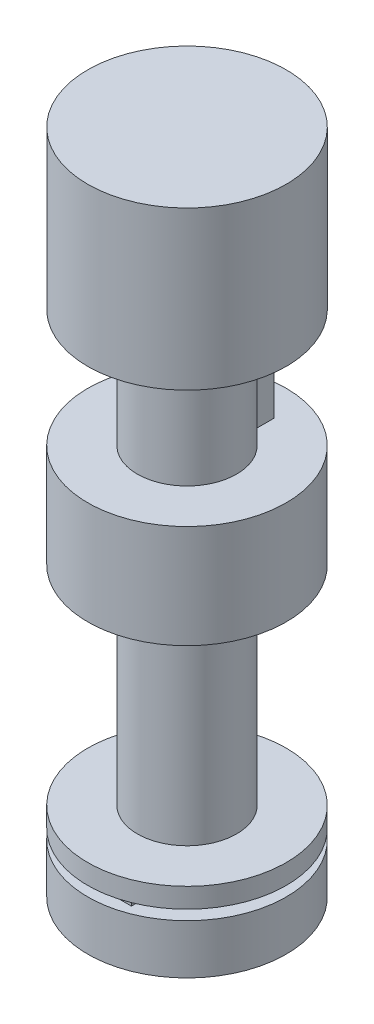
ISO-10303-21;
HEADER;
FILE_DESCRIPTION(('STEP AP214'),'2;1');
FILE_NAME('part.step','',(''),(''),'','','');
FILE_SCHEMA(('AUTOMOTIVE_DESIGN { 1 0 10303 214 1 1 1 1 }'));
ENDSEC;
DATA;
#1=APPLICATION_CONTEXT('core data for automotive mechanical design processes');
#2=APPLICATION_PROTOCOL_DEFINITION('international standard','automotive_design',2000,#1);
#3=PRODUCT_CONTEXT('',#1,'mechanical');
#4=PRODUCT('Part','Part','',(#3));
#5=PRODUCT_RELATED_PRODUCT_CATEGORY('part','',(#4));
#6=PRODUCT_DEFINITION_FORMATION('','',#4);
#7=PRODUCT_DEFINITION_CONTEXT('part definition',#1,'design');
#8=PRODUCT_DEFINITION('design','',#6,#7);
#9=PRODUCT_DEFINITION_SHAPE('','',#8);
#10=(LENGTH_UNIT() NAMED_UNIT(*) SI_UNIT(.MILLI.,.METRE.));
#11=(NAMED_UNIT(*) PLANE_ANGLE_UNIT() SI_UNIT($,.RADIAN.));
#12=(NAMED_UNIT(*) SI_UNIT($,.STERADIAN.) SOLID_ANGLE_UNIT());
#13=UNCERTAINTY_MEASURE_WITH_UNIT(LENGTH_MEASURE(1.E-05),#10,'distance_accuracy_value','');
#14=(GEOMETRIC_REPRESENTATION_CONTEXT(3) GLOBAL_UNCERTAINTY_ASSIGNED_CONTEXT((#13)) GLOBAL_UNIT_ASSIGNED_CONTEXT((#10,
#11,#12)) REPRESENTATION_CONTEXT('',''));
#15=CARTESIAN_POINT('',(0.,0.,0.));
#16=DIRECTION('',(0.,0.,1.));
#17=DIRECTION('',(1.,0.,0.));
#18=AXIS2_PLACEMENT_3D('',#15,#16,#17);
#19=CARTESIAN_POINT('',(0.,-33.4,0.));
#20=DIRECTION('',(0.,1.,0.));
#21=DIRECTION('',(0.,0.,1.));
#22=AXIS2_PLACEMENT_3D('',#19,#20,#21);
#23=CYLINDRICAL_SURFACE('',#22,5.);
#24=CARTESIAN_POINT('',(0.,-10.4,0.));
#25=DIRECTION('',(0.,-1.,0.));
#26=DIRECTION('',(0.,0.,-1.));
#27=AXIS2_PLACEMENT_3D('',#24,#25,#26);
#28=CIRCLE('',#27,5.);
#29=CARTESIAN_POINT('',(0.,-10.4,-5.));
#30=VERTEX_POINT('',#29);
#31=EDGE_CURVE('E50',#30,#30,#28,.T.);
#32=ORIENTED_EDGE('',*,*,#31,.T.);
#33=EDGE_LOOP('',(#32));
#34=FACE_BOUND('',#33,.T.);
#35=CARTESIAN_POINT('',(0.,-31.4,0.));
#36=DIRECTION('',(0.,-1.,0.));
#37=DIRECTION('',(0.,0.,-1.));
#38=AXIS2_PLACEMENT_3D('',#35,#36,#37);
#39=CIRCLE('',#38,5.);
#40=CARTESIAN_POINT('',(0.,-31.4,-5.));
#41=VERTEX_POINT('',#40);
#42=EDGE_CURVE('E11',#41,#41,#39,.T.);
#43=ORIENTED_EDGE('',*,*,#42,.F.);
#44=EDGE_LOOP('',(#43));
#45=FACE_BOUND('',#44,.T.);
#46=ADVANCED_FACE('F41',(#34,#45),#23,.T.);
#47=CARTESIAN_POINT('',(0.,11.9,0.));
#48=DIRECTION('',(0.,-1.,0.));
#49=DIRECTION('',(0.,0.,-1.));
#50=AXIS2_PLACEMENT_3D('',#47,#48,#49);
#51=CYLINDRICAL_SURFACE('',#50,5.);
#52=CARTESIAN_POINT('',(0.,0.,0.));
#53=DIRECTION('',(0.,1.,0.));
#54=DIRECTION('',(0.,0.,1.));
#55=AXIS2_PLACEMENT_3D('',#52,#53,#54);
#56=CIRCLE('',#55,5.);
#57=CARTESIAN_POINT('',(-2.,0.,-4.58257569495584));
#58=VERTEX_POINT('',#57);
#59=CARTESIAN_POINT('',(2.,0.,-4.58257569495584));
#60=VERTEX_POINT('',#59);
#61=EDGE_CURVE('E107',#58,#60,#56,.T.);
#62=ORIENTED_EDGE('',*,*,#61,.T.);
#63=DIRECTION('',(0.,-1.,0.));
#64=VECTOR('',#63,1.);
#65=CARTESIAN_POINT('',(2.,11.9,-4.58257569495584));
#66=LINE('',#65,#64);
#67=CARTESIAN_POINT('',(2.,11.9,-4.58257569495584));
#68=VERTEX_POINT('',#67);
#69=EDGE_CURVE('E120',#68,#60,#66,.T.);
#70=ORIENTED_EDGE('',*,*,#69,.F.);
#71=CARTESIAN_POINT('',(0.,11.9,0.));
#72=DIRECTION('',(0.,1.,0.));
#73=DIRECTION('',(0.,0.,1.));
#74=AXIS2_PLACEMENT_3D('',#71,#72,#73);
#75=CIRCLE('',#74,5.);
#76=CARTESIAN_POINT('',(-2.,11.9,-4.58257569495584));
#77=VERTEX_POINT('',#76);
#78=EDGE_CURVE('E109',#77,#68,#75,.T.);
#79=ORIENTED_EDGE('',*,*,#78,.F.);
#80=DIRECTION('',(0.,-1.,0.));
#81=VECTOR('',#80,1.);
#82=CARTESIAN_POINT('',(-2.,11.9,-4.58257569495584));
#83=LINE('',#82,#81);
#84=EDGE_CURVE('E92',#77,#58,#83,.T.);
#85=ORIENTED_EDGE('',*,*,#84,.T.);
#86=EDGE_LOOP('',(#62,#70,#79,#85));
#87=FACE_BOUND('',#86,.T.);
#88=ADVANCED_FACE('F43',(#87),#51,.T.);
#89=CARTESIAN_POINT('',(2.,11.9,0.));
#90=DIRECTION('',(1.,0.,0.));
#91=DIRECTION('',(0.,0.,-1.));
#92=AXIS2_PLACEMENT_3D('',#89,#90,#91);
#93=PLANE('',#92);
#94=DIRECTION('',(0.,0.,1.));
#95=VECTOR('',#94,1.);
#96=CARTESIAN_POINT('',(2.,0.,0.));
#97=LINE('',#96,#95);
#98=CARTESIAN_POINT('',(2.,0.,-6.78257569495584));
#99=VERTEX_POINT('',#98);
#100=EDGE_CURVE('E102',#99,#60,#97,.T.);
#101=ORIENTED_EDGE('',*,*,#100,.F.);
#102=DIRECTION('',(0.,-1.,0.));
#103=VECTOR('',#102,1.);
#104=CARTESIAN_POINT('',(2.,11.9,-6.78257569495584));
#105=LINE('',#104,#103);
#106=CARTESIAN_POINT('',(2.,11.9,-6.78257569495584));
#107=VERTEX_POINT('',#106);
#108=EDGE_CURVE('E91',#107,#99,#105,.T.);
#109=ORIENTED_EDGE('',*,*,#108,.F.);
#110=DIRECTION('',(0.,0.,1.));
#111=VECTOR('',#110,1.);
#112=CARTESIAN_POINT('',(2.,11.9,0.));
#113=LINE('',#112,#111);
#114=EDGE_CURVE('E113',#107,#68,#113,.T.);
#115=ORIENTED_EDGE('',*,*,#114,.T.);
#116=ORIENTED_EDGE('',*,*,#69,.T.);
#117=EDGE_LOOP('',(#101,#109,#115,#116));
#118=FACE_BOUND('',#117,.T.);
#119=ADVANCED_FACE('F164',(#118),#93,.T.);
#120=CARTESIAN_POINT('',(0.,11.9,-6.78257569495584));
#121=DIRECTION('',(0.,0.,-1.));
#122=DIRECTION('',(-1.,0.,0.));
#123=AXIS2_PLACEMENT_3D('',#120,#121,#122);
#124=PLANE('',#123);
#125=DIRECTION('',(1.,0.,0.));
#126=VECTOR('',#125,1.);
#127=CARTESIAN_POINT('',(0.,0.,-6.78257569495584));
#128=LINE('',#127,#126);
#129=CARTESIAN_POINT('',(-2.,0.,-6.78257569495584));
#130=VERTEX_POINT('',#129);
#131=EDGE_CURVE('E95',#130,#99,#128,.T.);
#132=ORIENTED_EDGE('',*,*,#131,.F.);
#133=DIRECTION('',(0.,-1.,0.));
#134=VECTOR('',#133,1.);
#135=CARTESIAN_POINT('',(-2.,11.9,-6.78257569495584));
#136=LINE('',#135,#134);
#137=CARTESIAN_POINT('',(-2.,11.9,-6.78257569495584));
#138=VERTEX_POINT('',#137);
#139=EDGE_CURVE('E81',#138,#130,#136,.T.);
#140=ORIENTED_EDGE('',*,*,#139,.F.);
#141=DIRECTION('',(1.,0.,0.));
#142=VECTOR('',#141,1.);
#143=CARTESIAN_POINT('',(0.,11.9,-6.78257569495584));
#144=LINE('',#143,#142);
#145=EDGE_CURVE('E66',#138,#107,#144,.T.);
#146=ORIENTED_EDGE('',*,*,#145,.T.);
#147=ORIENTED_EDGE('',*,*,#108,.T.);
#148=EDGE_LOOP('',(#132,#140,#146,#147));
#149=FACE_BOUND('',#148,.T.);
#150=ADVANCED_FACE('F96',(#149),#124,.T.);
#151=CARTESIAN_POINT('',(-2.,11.9,0.));
#152=DIRECTION('',(-1.,0.,0.));
#153=DIRECTION('',(0.,0.,1.));
#154=AXIS2_PLACEMENT_3D('',#151,#152,#153);
#155=PLANE('',#154);
#156=DIRECTION('',(0.,0.,-1.));
#157=VECTOR('',#156,1.);
#158=CARTESIAN_POINT('',(-2.,0.,0.));
#159=LINE('',#158,#157);
#160=EDGE_CURVE('E86',#58,#130,#159,.T.);
#161=ORIENTED_EDGE('',*,*,#160,.F.);
#162=ORIENTED_EDGE('',*,*,#84,.F.);
#163=DIRECTION('',(0.,0.,-1.));
#164=VECTOR('',#163,1.);
#165=CARTESIAN_POINT('',(-2.,11.9,0.));
#166=LINE('',#165,#164);
#167=EDGE_CURVE('E88',#77,#138,#166,.T.);
#168=ORIENTED_EDGE('',*,*,#167,.T.);
#169=ORIENTED_EDGE('',*,*,#139,.T.);
#170=EDGE_LOOP('',(#161,#162,#168,#169));
#171=FACE_BOUND('',#170,.T.);
#172=ADVANCED_FACE('F83',(#171),#155,.T.);
#173=CARTESIAN_POINT('',(0.,11.9,0.));
#174=DIRECTION('',(0.,1.,0.));
#175=DIRECTION('',(0.,0.,1.));
#176=AXIS2_PLACEMENT_3D('',#173,#174,#175);
#177=PLANE('',#176);
#178=CARTESIAN_POINT('',(0.,11.9,0.));
#179=DIRECTION('',(0.,1.,0.));
#180=DIRECTION('',(0.,0.,1.));
#181=AXIS2_PLACEMENT_3D('',#178,#179,#180);
#182=CIRCLE('',#181,10.);
#183=CARTESIAN_POINT('',(0.,11.9,10.));
#184=VERTEX_POINT('',#183);
#185=EDGE_CURVE('E140',#184,#184,#182,.T.);
#186=ORIENTED_EDGE('',*,*,#185,.F.);
#187=EDGE_LOOP('',(#186));
#188=FACE_BOUND('',#187,.T.);
#189=ORIENTED_EDGE('',*,*,#167,.F.);
#190=ORIENTED_EDGE('',*,*,#78,.T.);
#191=ORIENTED_EDGE('',*,*,#114,.F.);
#192=ORIENTED_EDGE('',*,*,#145,.F.);
#193=EDGE_LOOP('',(#189,#190,#191,#192));
#194=FACE_BOUND('',#193,.T.);
#195=ADVANCED_FACE('F349',(#188,#194),#177,.F.);
#196=CARTESIAN_POINT('',(0.,27.8,0.));
#197=DIRECTION('',(0.,-1.,0.));
#198=DIRECTION('',(0.,0.,-1.));
#199=AXIS2_PLACEMENT_3D('',#196,#197,#198);
#200=CYLINDRICAL_SURFACE('',#199,10.);
#201=CARTESIAN_POINT('',(0.,27.8,0.));
#202=DIRECTION('',(0.,1.,0.));
#203=DIRECTION('',(0.,0.,1.));
#204=AXIS2_PLACEMENT_3D('',#201,#202,#203);
#205=CIRCLE('',#204,10.);
#206=CARTESIAN_POINT('',(0.,27.8,10.));
#207=VERTEX_POINT('',#206);
#208=EDGE_CURVE('E146',#207,#207,#205,.T.);
#209=ORIENTED_EDGE('',*,*,#208,.F.);
#210=EDGE_LOOP('',(#209));
#211=FACE_BOUND('',#210,.T.);
#212=ORIENTED_EDGE('',*,*,#185,.T.);
#213=EDGE_LOOP('',(#212));
#214=FACE_BOUND('',#213,.T.);
#215=ADVANCED_FACE('F347',(#211,#214),#200,.T.);
#216=CARTESIAN_POINT('',(0.,27.8,0.));
#217=DIRECTION('',(0.,1.,0.));
#218=DIRECTION('',(0.,0.,1.));
#219=AXIS2_PLACEMENT_3D('',#216,#217,#218);
#220=PLANE('',#219);
#221=ORIENTED_EDGE('',*,*,#208,.T.);
#222=EDGE_LOOP('',(#221));
#223=FACE_BOUND('',#222,.T.);
#224=ADVANCED_FACE('F343',(#223),#220,.T.);
#225=CARTESIAN_POINT('',(0.,-10.4,0.));
#226=DIRECTION('',(0.,1.,0.));
#227=DIRECTION('',(0.,0.,1.));
#228=AXIS2_PLACEMENT_3D('',#225,#226,#227);
#229=CYLINDRICAL_SURFACE('',#228,10.);
#230=CARTESIAN_POINT('',(0.,-10.4,0.));
#231=DIRECTION('',(0.,-1.,0.));
#232=DIRECTION('',(0.,0.,-1.));
#233=AXIS2_PLACEMENT_3D('',#230,#231,#232);
#234=CIRCLE('',#233,10.);
#235=CARTESIAN_POINT('',(0.,-10.4,-10.));
#236=VERTEX_POINT('',#235);
#237=EDGE_CURVE('E136',#236,#236,#234,.T.);
#238=ORIENTED_EDGE('',*,*,#237,.F.);
#239=EDGE_LOOP('',(#238));
#240=FACE_BOUND('',#239,.T.);
#241=CARTESIAN_POINT('',(0.,0.,0.));
#242=DIRECTION('',(0.,-1.,0.));
#243=DIRECTION('',(0.,0.,-1.));
#244=AXIS2_PLACEMENT_3D('',#241,#242,#243);
#245=CIRCLE('',#244,10.);
#246=CARTESIAN_POINT('',(0.,0.,-10.));
#247=VERTEX_POINT('',#246);
#248=EDGE_CURVE('E141',#247,#247,#245,.T.);
#249=ORIENTED_EDGE('',*,*,#248,.T.);
#250=EDGE_LOOP('',(#249));
#251=FACE_BOUND('',#250,.T.);
#252=ADVANCED_FACE('F338',(#240,#251),#229,.T.);
#253=CARTESIAN_POINT('',(0.,-10.4,0.));
#254=DIRECTION('',(0.,-1.,0.));
#255=DIRECTION('',(0.,0.,-1.));
#256=AXIS2_PLACEMENT_3D('',#253,#254,#255);
#257=PLANE('',#256);
#258=ORIENTED_EDGE('',*,*,#31,.F.);
#259=EDGE_LOOP('',(#258));
#260=FACE_BOUND('',#259,.T.);
#261=ORIENTED_EDGE('',*,*,#237,.T.);
#262=EDGE_LOOP('',(#261));
#263=FACE_BOUND('',#262,.T.);
#264=ADVANCED_FACE('F325',(#260,#263),#257,.T.);
#265=CARTESIAN_POINT('',(0.,0.,0.));
#266=DIRECTION('',(0.,-1.,0.));
#267=DIRECTION('',(0.,0.,-1.));
#268=AXIS2_PLACEMENT_3D('',#265,#266,#267);
#269=PLANE('',#268);
#270=ORIENTED_EDGE('',*,*,#61,.F.);
#271=ORIENTED_EDGE('',*,*,#160,.T.);
#272=ORIENTED_EDGE('',*,*,#131,.T.);
#273=ORIENTED_EDGE('',*,*,#100,.T.);
#274=EDGE_LOOP('',(#270,#271,#272,#273));
#275=FACE_BOUND('',#274,.T.);
#276=ORIENTED_EDGE('',*,*,#248,.F.);
#277=EDGE_LOOP('',(#276));
#278=FACE_BOUND('',#277,.T.);
#279=ADVANCED_FACE('F104',(#275,#278),#269,.F.);
#280=CARTESIAN_POINT('',(0.,-31.4,0.));
#281=DIRECTION('',(0.,-1.,0.));
#282=DIRECTION('',(0.,0.,-1.));
#283=AXIS2_PLACEMENT_3D('',#280,#281,#282);
#284=CYLINDRICAL_SURFACE('',#283,10.);
#285=CARTESIAN_POINT('',(0.,-31.4,0.));
#286=DIRECTION('',(0.,-1.,0.));
#287=DIRECTION('',(0.,0.,-1.));
#288=AXIS2_PLACEMENT_3D('',#285,#286,#287);
#289=CIRCLE('',#288,10.);
#290=CARTESIAN_POINT('',(0.,-31.4,-10.));
#291=VERTEX_POINT('',#290);
#292=EDGE_CURVE('E145',#291,#291,#289,.T.);
#293=ORIENTED_EDGE('',*,*,#292,.T.);
#294=EDGE_LOOP('',(#293));
#295=FACE_BOUND('',#294,.T.);
#296=CARTESIAN_POINT('',(0.,-33.4,0.));
#297=DIRECTION('',(0.,-1.,0.));
#298=DIRECTION('',(0.,0.,-1.));
#299=AXIS2_PLACEMENT_3D('',#296,#297,#298);
#300=CIRCLE('',#299,10.);
#301=CARTESIAN_POINT('',(0.,-33.4,-10.));
#302=VERTEX_POINT('',#301);
#303=EDGE_CURVE('E134',#302,#302,#300,.T.);
#304=ORIENTED_EDGE('',*,*,#303,.F.);
#305=EDGE_LOOP('',(#304));
#306=FACE_BOUND('',#305,.T.);
#307=ADVANCED_FACE('F314',(#295,#306),#284,.T.);
#308=CARTESIAN_POINT('',(0.,-31.4,0.));
#309=DIRECTION('',(0.,-1.,0.));
#310=DIRECTION('',(0.,0.,-1.));
#311=AXIS2_PLACEMENT_3D('',#308,#309,#310);
#312=PLANE('',#311);
#313=ORIENTED_EDGE('',*,*,#42,.T.);
#314=EDGE_LOOP('',(#313));
#315=FACE_BOUND('',#314,.T.);
#316=ORIENTED_EDGE('',*,*,#292,.F.);
#317=EDGE_LOOP('',(#316));
#318=FACE_BOUND('',#317,.T.);
#319=ADVANCED_FACE('F316',(#315,#318),#312,.F.);
#320=CARTESIAN_POINT('',(0.,-33.4,0.));
#321=DIRECTION('',(0.,-1.,0.));
#322=DIRECTION('',(0.,0.,-1.));
#323=AXIS2_PLACEMENT_3D('',#320,#321,#322);
#324=PLANE('',#323);
#325=CARTESIAN_POINT('',(0.,-33.4,0.));
#326=DIRECTION('',(0.,-1.,0.));
#327=DIRECTION('',(0.,0.,-1.));
#328=AXIS2_PLACEMENT_3D('',#325,#326,#327);
#329=CIRCLE('',#328,5.);
#330=CARTESIAN_POINT('',(3.,-33.4,-4.));
#331=VERTEX_POINT('',#330);
#332=CARTESIAN_POINT('',(3.,-33.4,4.));
#333=VERTEX_POINT('',#332);
#334=EDGE_CURVE('E57',#331,#333,#329,.T.);
#335=ORIENTED_EDGE('',*,*,#334,.F.);
#336=DIRECTION('',(0.,0.,-1.));
#337=VECTOR('',#336,1.);
#338=CARTESIAN_POINT('',(3.,-33.4,0.));
#339=LINE('',#338,#337);
#340=CARTESIAN_POINT('',(3.,-33.4,-8.6));
#341=VERTEX_POINT('',#340);
#342=EDGE_CURVE('E227',#331,#341,#339,.T.);
#343=ORIENTED_EDGE('',*,*,#342,.T.);
#344=DIRECTION('',(1.,0.,0.));
#345=VECTOR('',#344,1.);
#346=CARTESIAN_POINT('',(0.,-33.4,-8.6));
#347=LINE('',#346,#345);
#348=CARTESIAN_POINT('',(-3.,-33.4,-8.6));
#349=VERTEX_POINT('',#348);
#350=EDGE_CURVE('E242',#349,#341,#347,.T.);
#351=ORIENTED_EDGE('',*,*,#350,.F.);
#352=DIRECTION('',(0.,0.,-1.));
#353=VECTOR('',#352,1.);
#354=CARTESIAN_POINT('',(-3.,-33.4,0.));
#355=LINE('',#354,#353);
#356=CARTESIAN_POINT('',(-3.,-33.4,-4.));
#357=VERTEX_POINT('',#356);
#358=EDGE_CURVE('E277',#357,#349,#355,.T.);
#359=ORIENTED_EDGE('',*,*,#358,.F.);
#360=CARTESIAN_POINT('',(-3.,-33.4,4.));
#361=VERTEX_POINT('',#360);
#362=EDGE_CURVE('E266',#361,#357,#329,.T.);
#363=ORIENTED_EDGE('',*,*,#362,.F.);
#364=DIRECTION('',(0.,0.,-1.));
#365=VECTOR('',#364,1.);
#366=CARTESIAN_POINT('',(-3.,-33.4,0.));
#367=LINE('',#366,#365);
#368=CARTESIAN_POINT('',(-3.,-33.4,8.6));
#369=VERTEX_POINT('',#368);
#370=EDGE_CURVE('E274',#369,#361,#367,.T.);
#371=ORIENTED_EDGE('',*,*,#370,.F.);
#372=DIRECTION('',(1.,0.,0.));
#373=VECTOR('',#372,1.);
#374=CARTESIAN_POINT('',(0.,-33.4,8.6));
#375=LINE('',#374,#373);
#376=CARTESIAN_POINT('',(3.,-33.4,8.6));
#377=VERTEX_POINT('',#376);
#378=EDGE_CURVE('E270',#369,#377,#375,.T.);
#379=ORIENTED_EDGE('',*,*,#378,.T.);
#380=DIRECTION('',(0.,0.,-1.));
#381=VECTOR('',#380,1.);
#382=CARTESIAN_POINT('',(3.,-33.4,0.));
#383=LINE('',#382,#381);
#384=EDGE_CURVE('E264',#377,#333,#383,.T.);
#385=ORIENTED_EDGE('',*,*,#384,.T.);
#386=EDGE_LOOP('',(#335,#343,#351,#359,#363,#371,#379,#385));
#387=FACE_BOUND('',#386,.T.);
#388=ORIENTED_EDGE('',*,*,#303,.T.);
#389=EDGE_LOOP('',(#388));
#390=FACE_BOUND('',#389,.T.);
#391=ADVANCED_FACE('F312',(#387,#390),#324,.T.);
#392=CARTESIAN_POINT('',(0.,-34.4,0.));
#393=DIRECTION('',(0.,1.,0.));
#394=DIRECTION('',(0.,0.,1.));
#395=AXIS2_PLACEMENT_3D('',#392,#393,#394);
#396=CYLINDRICAL_SURFACE('',#395,5.);
#397=ORIENTED_EDGE('',*,*,#334,.T.);
#398=DIRECTION('',(0.,1.,0.));
#399=VECTOR('',#398,1.);
#400=CARTESIAN_POINT('',(3.,-34.4,4.));
#401=LINE('',#400,#399);
#402=CARTESIAN_POINT('',(3.,-34.4,4.));
#403=VERTEX_POINT('',#402);
#404=EDGE_CURVE('E232',#403,#333,#401,.T.);
#405=ORIENTED_EDGE('',*,*,#404,.F.);
#406=CARTESIAN_POINT('',(0.,-34.4,0.));
#407=DIRECTION('',(0.,-1.,0.));
#408=DIRECTION('',(0.,0.,-1.));
#409=AXIS2_PLACEMENT_3D('',#406,#407,#408);
#410=CIRCLE('',#409,5.);
#411=CARTESIAN_POINT('',(3.,-34.4,-4.));
#412=VERTEX_POINT('',#411);
#413=EDGE_CURVE('E216',#412,#403,#410,.T.);
#414=ORIENTED_EDGE('',*,*,#413,.F.);
#415=DIRECTION('',(0.,1.,0.));
#416=VECTOR('',#415,1.);
#417=CARTESIAN_POINT('',(3.,-34.4,-4.));
#418=LINE('',#417,#416);
#419=EDGE_CURVE('E222',#412,#331,#418,.T.);
#420=ORIENTED_EDGE('',*,*,#419,.T.);
#421=EDGE_LOOP('',(#397,#405,#414,#420));
#422=FACE_BOUND('',#421,.T.);
#423=ADVANCED_FACE('F231',(#422),#396,.T.);
#424=CARTESIAN_POINT('',(3.,-34.4,0.));
#425=DIRECTION('',(1.,0.,0.));
#426=DIRECTION('',(0.,0.,-1.));
#427=AXIS2_PLACEMENT_3D('',#424,#425,#426);
#428=PLANE('',#427);
#429=ORIENTED_EDGE('',*,*,#384,.F.);
#430=DIRECTION('',(0.,1.,0.));
#431=VECTOR('',#430,1.);
#432=CARTESIAN_POINT('',(3.,-34.4,8.6));
#433=LINE('',#432,#431);
#434=CARTESIAN_POINT('',(3.,-34.4,8.6));
#435=VERTEX_POINT('',#434);
#436=EDGE_CURVE('E300',#435,#377,#433,.T.);
#437=ORIENTED_EDGE('',*,*,#436,.F.);
#438=DIRECTION('',(0.,0.,-1.));
#439=VECTOR('',#438,1.);
#440=CARTESIAN_POINT('',(3.,-34.4,0.));
#441=LINE('',#440,#439);
#442=EDGE_CURVE('E235',#435,#403,#441,.T.);
#443=ORIENTED_EDGE('',*,*,#442,.T.);
#444=ORIENTED_EDGE('',*,*,#404,.T.);
#445=EDGE_LOOP('',(#429,#437,#443,#444));
#446=FACE_BOUND('',#445,.T.);
#447=ADVANCED_FACE('F425',(#446),#428,.T.);
#448=CARTESIAN_POINT('',(0.,-34.4,8.6));
#449=DIRECTION('',(0.,0.,1.));
#450=DIRECTION('',(1.,0.,0.));
#451=AXIS2_PLACEMENT_3D('',#448,#449,#450);
#452=PLANE('',#451);
#453=ORIENTED_EDGE('',*,*,#378,.F.);
#454=DIRECTION('',(0.,1.,0.));
#455=VECTOR('',#454,1.);
#456=CARTESIAN_POINT('',(-3.,-34.4,8.6));
#457=LINE('',#456,#455);
#458=CARTESIAN_POINT('',(-3.,-34.4,8.6));
#459=VERTEX_POINT('',#458);
#460=EDGE_CURVE('E297',#459,#369,#457,.T.);
#461=ORIENTED_EDGE('',*,*,#460,.F.);
#462=DIRECTION('',(1.,0.,0.));
#463=VECTOR('',#462,1.);
#464=CARTESIAN_POINT('',(0.,-34.4,8.6));
#465=LINE('',#464,#463);
#466=EDGE_CURVE('E240',#459,#435,#465,.T.);
#467=ORIENTED_EDGE('',*,*,#466,.T.);
#468=ORIENTED_EDGE('',*,*,#436,.T.);
#469=EDGE_LOOP('',(#453,#461,#467,#468));
#470=FACE_BOUND('',#469,.T.);
#471=ADVANCED_FACE('F434',(#470),#452,.T.);
#472=CARTESIAN_POINT('',(-3.,-34.4,0.));
#473=DIRECTION('',(1.,0.,0.));
#474=DIRECTION('',(0.,0.,-1.));
#475=AXIS2_PLACEMENT_3D('',#472,#473,#474);
#476=PLANE('',#475);
#477=ORIENTED_EDGE('',*,*,#370,.T.);
#478=DIRECTION('',(0.,1.,0.));
#479=VECTOR('',#478,1.);
#480=CARTESIAN_POINT('',(-3.,-34.4,4.));
#481=LINE('',#480,#479);
#482=CARTESIAN_POINT('',(-3.,-34.4,4.));
#483=VERTEX_POINT('',#482);
#484=EDGE_CURVE('E293',#483,#361,#481,.T.);
#485=ORIENTED_EDGE('',*,*,#484,.F.);
#486=DIRECTION('',(0.,0.,-1.));
#487=VECTOR('',#486,1.);
#488=CARTESIAN_POINT('',(-3.,-34.4,0.));
#489=LINE('',#488,#487);
#490=EDGE_CURVE('E247',#459,#483,#489,.T.);
#491=ORIENTED_EDGE('',*,*,#490,.F.);
#492=ORIENTED_EDGE('',*,*,#460,.T.);
#493=EDGE_LOOP('',(#477,#485,#491,#492));
#494=FACE_BOUND('',#493,.T.);
#495=ADVANCED_FACE('F443',(#494),#476,.F.);
#496=ORIENTED_EDGE('',*,*,#362,.T.);
#497=DIRECTION('',(0.,1.,0.));
#498=VECTOR('',#497,1.);
#499=CARTESIAN_POINT('',(-3.,-34.4,-4.));
#500=LINE('',#499,#498);
#501=CARTESIAN_POINT('',(-3.,-34.4,-4.));
#502=VERTEX_POINT('',#501);
#503=EDGE_CURVE('E289',#502,#357,#500,.T.);
#504=ORIENTED_EDGE('',*,*,#503,.F.);
#505=EDGE_CURVE('E237',#483,#502,#410,.T.);
#506=ORIENTED_EDGE('',*,*,#505,.F.);
#507=ORIENTED_EDGE('',*,*,#484,.T.);
#508=EDGE_LOOP('',(#496,#504,#506,#507));
#509=FACE_BOUND('',#508,.T.);
#510=ADVANCED_FACE('F427',(#509),#396,.T.);
#511=CARTESIAN_POINT('',(-3.,-34.4,0.));
#512=DIRECTION('',(1.,0.,0.));
#513=DIRECTION('',(0.,0.,-1.));
#514=AXIS2_PLACEMENT_3D('',#511,#512,#513);
#515=PLANE('',#514);
#516=ORIENTED_EDGE('',*,*,#358,.T.);
#517=DIRECTION('',(0.,1.,0.));
#518=VECTOR('',#517,1.);
#519=CARTESIAN_POINT('',(-3.,-34.4,-8.6));
#520=LINE('',#519,#518);
#521=CARTESIAN_POINT('',(-3.,-34.4,-8.6));
#522=VERTEX_POINT('',#521);
#523=EDGE_CURVE('E285',#522,#349,#520,.T.);
#524=ORIENTED_EDGE('',*,*,#523,.F.);
#525=DIRECTION('',(0.,0.,-1.));
#526=VECTOR('',#525,1.);
#527=CARTESIAN_POINT('',(-3.,-34.4,0.));
#528=LINE('',#527,#526);
#529=EDGE_CURVE('E246',#502,#522,#528,.T.);
#530=ORIENTED_EDGE('',*,*,#529,.F.);
#531=ORIENTED_EDGE('',*,*,#503,.T.);
#532=EDGE_LOOP('',(#516,#524,#530,#531));
#533=FACE_BOUND('',#532,.T.);
#534=ADVANCED_FACE('F460',(#533),#515,.F.);
#535=CARTESIAN_POINT('',(0.,-34.4,-8.6));
#536=DIRECTION('',(0.,0.,1.));
#537=DIRECTION('',(1.,0.,0.));
#538=AXIS2_PLACEMENT_3D('',#535,#536,#537);
#539=PLANE('',#538);
#540=ORIENTED_EDGE('',*,*,#350,.T.);
#541=DIRECTION('',(0.,1.,0.));
#542=VECTOR('',#541,1.);
#543=CARTESIAN_POINT('',(3.,-34.4,-8.6));
#544=LINE('',#543,#542);
#545=CARTESIAN_POINT('',(3.,-34.4,-8.6));
#546=VERTEX_POINT('',#545);
#547=EDGE_CURVE('E229',#546,#341,#544,.T.);
#548=ORIENTED_EDGE('',*,*,#547,.F.);
#549=DIRECTION('',(1.,0.,0.));
#550=VECTOR('',#549,1.);
#551=CARTESIAN_POINT('',(0.,-34.4,-8.6));
#552=LINE('',#551,#550);
#553=EDGE_CURVE('E218',#522,#546,#552,.T.);
#554=ORIENTED_EDGE('',*,*,#553,.F.);
#555=ORIENTED_EDGE('',*,*,#523,.T.);
#556=EDGE_LOOP('',(#540,#548,#554,#555));
#557=FACE_BOUND('',#556,.T.);
#558=ADVANCED_FACE('F468',(#557),#539,.F.);
#559=CARTESIAN_POINT('',(3.,-34.4,0.));
#560=DIRECTION('',(1.,0.,0.));
#561=DIRECTION('',(0.,0.,-1.));
#562=AXIS2_PLACEMENT_3D('',#559,#560,#561);
#563=PLANE('',#562);
#564=ORIENTED_EDGE('',*,*,#342,.F.);
#565=ORIENTED_EDGE('',*,*,#419,.F.);
#566=DIRECTION('',(0.,0.,-1.));
#567=VECTOR('',#566,1.);
#568=CARTESIAN_POINT('',(3.,-34.4,0.));
#569=LINE('',#568,#567);
#570=EDGE_CURVE('E212',#412,#546,#569,.T.);
#571=ORIENTED_EDGE('',*,*,#570,.T.);
#572=ORIENTED_EDGE('',*,*,#547,.T.);
#573=EDGE_LOOP('',(#564,#565,#571,#572));
#574=FACE_BOUND('',#573,.T.);
#575=ADVANCED_FACE('F225',(#574),#563,.T.);
#576=CARTESIAN_POINT('',(0.,-34.4,0.));
#577=DIRECTION('',(0.,-1.,0.));
#578=DIRECTION('',(0.,0.,-1.));
#579=AXIS2_PLACEMENT_3D('',#576,#577,#578);
#580=PLANE('',#579);
#581=CARTESIAN_POINT('',(0.,-34.4,0.));
#582=DIRECTION('',(0.,-1.,0.));
#583=DIRECTION('',(0.,0.,-1.));
#584=AXIS2_PLACEMENT_3D('',#581,#582,#583);
#585=CIRCLE('',#584,10.);
#586=CARTESIAN_POINT('',(0.,-34.4,-10.));
#587=VERTEX_POINT('',#586);
#588=EDGE_CURVE('E528',#587,#587,#585,.T.);
#589=ORIENTED_EDGE('',*,*,#588,.F.);
#590=EDGE_LOOP('',(#589));
#591=FACE_BOUND('',#590,.T.);
#592=ORIENTED_EDGE('',*,*,#570,.F.);
#593=ORIENTED_EDGE('',*,*,#413,.T.);
#594=ORIENTED_EDGE('',*,*,#442,.F.);
#595=ORIENTED_EDGE('',*,*,#466,.F.);
#596=ORIENTED_EDGE('',*,*,#490,.T.);
#597=ORIENTED_EDGE('',*,*,#505,.T.);
#598=ORIENTED_EDGE('',*,*,#529,.T.);
#599=ORIENTED_EDGE('',*,*,#553,.T.);
#600=EDGE_LOOP('',(#592,#593,#594,#595,#596,#597,#598,#599));
#601=FACE_BOUND('',#600,.T.);
#602=ADVANCED_FACE('F214',(#591,#601),#580,.F.);
#603=CARTESIAN_POINT('',(0.,-39.4,0.));
#604=DIRECTION('',(0.,1.,0.));
#605=DIRECTION('',(0.,0.,1.));
#606=AXIS2_PLACEMENT_3D('',#603,#604,#605);
#607=CYLINDRICAL_SURFACE('',#606,10.);
#608=CARTESIAN_POINT('',(0.,-39.4,0.));
#609=DIRECTION('',(0.,-1.,0.));
#610=DIRECTION('',(0.,0.,-1.));
#611=AXIS2_PLACEMENT_3D('',#608,#609,#610);
#612=CIRCLE('',#611,10.);
#613=CARTESIAN_POINT('',(0.,-39.4,-10.));
#614=VERTEX_POINT('',#613);
#615=EDGE_CURVE('E265',#614,#614,#612,.T.);
#616=ORIENTED_EDGE('',*,*,#615,.F.);
#617=EDGE_LOOP('',(#616));
#618=FACE_BOUND('',#617,.T.);
#619=ORIENTED_EDGE('',*,*,#588,.T.);
#620=EDGE_LOOP('',(#619));
#621=FACE_BOUND('',#620,.T.);
#622=ADVANCED_FACE('F492',(#618,#621),#607,.T.);
#623=CARTESIAN_POINT('',(0.,-39.4,0.));
#624=DIRECTION('',(0.,-1.,0.));
#625=DIRECTION('',(0.,0.,-1.));
#626=AXIS2_PLACEMENT_3D('',#623,#624,#625);
#627=PLANE('',#626);
#628=ORIENTED_EDGE('',*,*,#615,.T.);
#629=EDGE_LOOP('',(#628));
#630=FACE_BOUND('',#629,.T.);
#631=ADVANCED_FACE('F501',(#630),#627,.T.);
#632=CLOSED_SHELL('',(#46,#88,#119,#150,#172,#195,#215,#224,#252,#264,#279,#307,#319,#391,#423,
#447,#471,#495,#510,#534,#558,#575,#602,#622,#631));
#633=MANIFOLD_SOLID_BREP('B2',#632);
#634=ADVANCED_BREP_SHAPE_REPRESENTATION('',(#18,#633),#14);
#635=SHAPE_DEFINITION_REPRESENTATION(#9,#634);
ENDSEC;
END-ISO-10303-21;
